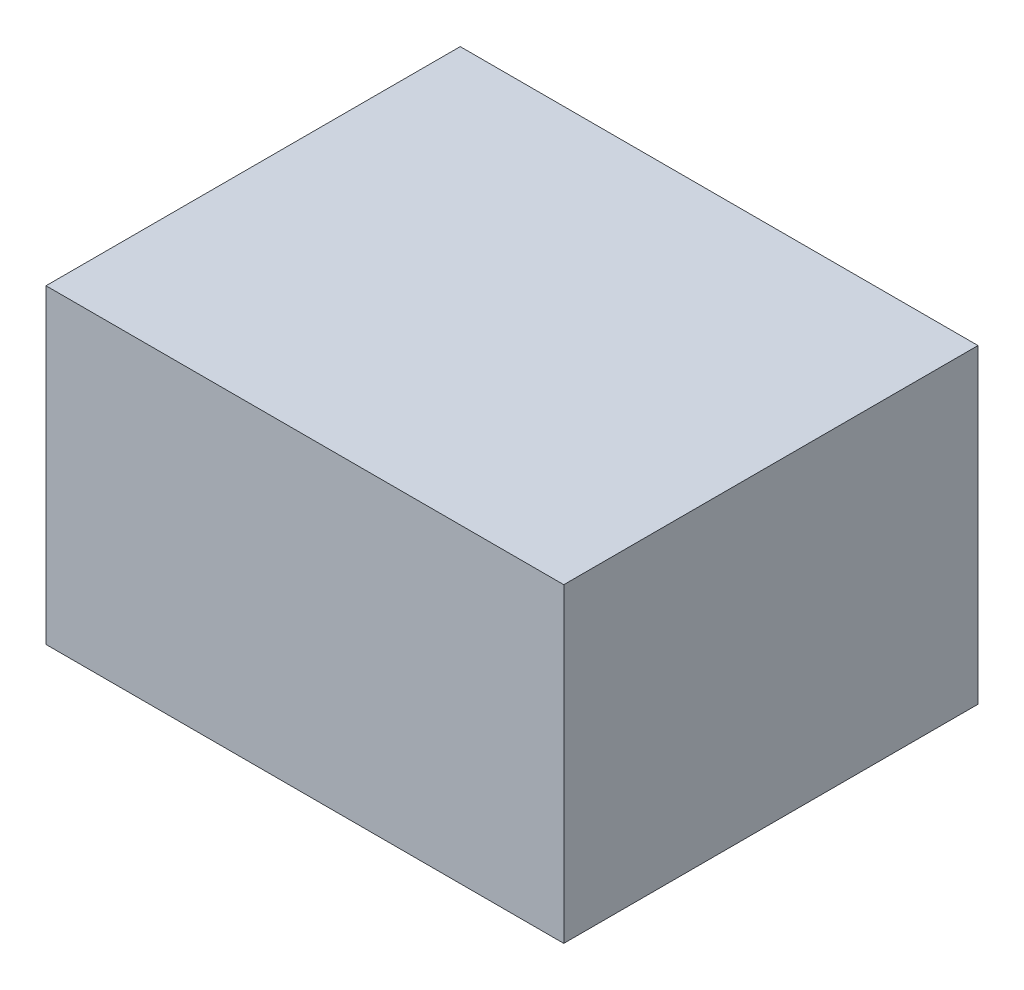
ISO-10303-21;
HEADER;
FILE_DESCRIPTION(('STEP AP214'),'2;1');
FILE_NAME('part.step','',(''),(''),'','','');
FILE_SCHEMA(('AUTOMOTIVE_DESIGN { 1 0 10303 214 1 1 1 1 }'));
ENDSEC;
DATA;
#1=APPLICATION_CONTEXT('core data for automotive mechanical design processes');
#2=APPLICATION_PROTOCOL_DEFINITION('international standard','automotive_design',2000,#1);
#3=PRODUCT_CONTEXT('',#1,'mechanical');
#4=PRODUCT('Part','Part','',(#3));
#5=PRODUCT_RELATED_PRODUCT_CATEGORY('part','',(#4));
#6=PRODUCT_DEFINITION_FORMATION('','',#4);
#7=PRODUCT_DEFINITION_CONTEXT('part definition',#1,'design');
#8=PRODUCT_DEFINITION('design','',#6,#7);
#9=PRODUCT_DEFINITION_SHAPE('','',#8);
#10=(LENGTH_UNIT() NAMED_UNIT(*) SI_UNIT(.MILLI.,.METRE.));
#11=(NAMED_UNIT(*) PLANE_ANGLE_UNIT() SI_UNIT($,.RADIAN.));
#12=(NAMED_UNIT(*) SI_UNIT($,.STERADIAN.) SOLID_ANGLE_UNIT());
#13=UNCERTAINTY_MEASURE_WITH_UNIT(LENGTH_MEASURE(1.E-05),#10,'distance_accuracy_value','');
#14=(GEOMETRIC_REPRESENTATION_CONTEXT(3) GLOBAL_UNCERTAINTY_ASSIGNED_CONTEXT((#13)) GLOBAL_UNIT_ASSIGNED_CONTEXT((#10,
#11,#12)) REPRESENTATION_CONTEXT('',''));
#15=CARTESIAN_POINT('',(0.,0.,0.));
#16=DIRECTION('',(0.,0.,1.));
#17=DIRECTION('',(1.,0.,0.));
#18=AXIS2_PLACEMENT_3D('',#15,#16,#17);
#19=CARTESIAN_POINT('',(0.,0.,40.));
#20=DIRECTION('',(1.,0.,0.));
#21=DIRECTION('',(0.,1.,0.));
#22=AXIS2_PLACEMENT_3D('',#19,#20,#21);
#23=PLANE('',#22);
#24=DIRECTION('',(0.,-1.,0.));
#25=VECTOR('',#24,1.);
#26=CARTESIAN_POINT('',(0.,0.,0.));
#27=LINE('',#26,#25);
#28=CARTESIAN_POINT('',(0.,30.,0.));
#29=VERTEX_POINT('',#28);
#30=CARTESIAN_POINT('',(0.,0.,0.));
#31=VERTEX_POINT('',#30);
#32=EDGE_CURVE('E107',#29,#31,#27,.T.);
#33=ORIENTED_EDGE('',*,*,#32,.T.);
#34=DIRECTION('',(0.,0.,-1.));
#35=VECTOR('',#34,1.);
#36=CARTESIAN_POINT('',(0.,0.,40.));
#37=LINE('',#36,#35);
#38=CARTESIAN_POINT('',(0.,0.,40.));
#39=VERTEX_POINT('',#38);
#40=EDGE_CURVE('E11',#39,#31,#37,.T.);
#41=ORIENTED_EDGE('',*,*,#40,.F.);
#42=DIRECTION('',(0.,-1.,0.));
#43=VECTOR('',#42,1.);
#44=CARTESIAN_POINT('',(0.,0.,40.));
#45=LINE('',#44,#43);
#46=CARTESIAN_POINT('',(0.,30.,40.));
#47=VERTEX_POINT('',#46);
#48=EDGE_CURVE('E91',#47,#39,#45,.T.);
#49=ORIENTED_EDGE('',*,*,#48,.F.);
#50=DIRECTION('',(0.,0.,-1.));
#51=VECTOR('',#50,1.);
#52=CARTESIAN_POINT('',(0.,30.,40.));
#53=LINE('',#52,#51);
#54=EDGE_CURVE('E103',#47,#29,#53,.T.);
#55=ORIENTED_EDGE('',*,*,#54,.T.);
#56=EDGE_LOOP('',(#33,#41,#49,#55));
#57=FACE_BOUND('',#56,.T.);
#58=ADVANCED_FACE('F39',(#57),#23,.F.);
#59=CARTESIAN_POINT('',(0.,0.,40.));
#60=DIRECTION('',(0.,1.,0.));
#61=DIRECTION('',(0.,0.,1.));
#62=AXIS2_PLACEMENT_3D('',#59,#60,#61);
#63=PLANE('',#62);
#64=DIRECTION('',(1.,0.,0.));
#65=VECTOR('',#64,1.);
#66=CARTESIAN_POINT('',(0.,0.,0.));
#67=LINE('',#66,#65);
#68=CARTESIAN_POINT('',(50.,0.,0.));
#69=VERTEX_POINT('',#68);
#70=EDGE_CURVE('E96',#31,#69,#67,.T.);
#71=ORIENTED_EDGE('',*,*,#70,.T.);
#72=DIRECTION('',(0.,0.,-1.));
#73=VECTOR('',#72,1.);
#74=CARTESIAN_POINT('',(50.,0.,40.));
#75=LINE('',#74,#73);
#76=CARTESIAN_POINT('',(50.,0.,40.));
#77=VERTEX_POINT('',#76);
#78=EDGE_CURVE('E48',#77,#69,#75,.T.);
#79=ORIENTED_EDGE('',*,*,#78,.F.);
#80=DIRECTION('',(1.,0.,0.));
#81=VECTOR('',#80,1.);
#82=CARTESIAN_POINT('',(0.,0.,40.));
#83=LINE('',#82,#81);
#84=EDGE_CURVE('E86',#39,#77,#83,.T.);
#85=ORIENTED_EDGE('',*,*,#84,.F.);
#86=ORIENTED_EDGE('',*,*,#40,.T.);
#87=EDGE_LOOP('',(#71,#79,#85,#86));
#88=FACE_BOUND('',#87,.T.);
#89=ADVANCED_FACE('F95',(#88),#63,.F.);
#90=CARTESIAN_POINT('',(50.,0.,40.));
#91=DIRECTION('',(-1.,0.,0.));
#92=DIRECTION('',(0.,-1.,0.));
#93=AXIS2_PLACEMENT_3D('',#90,#91,#92);
#94=PLANE('',#93);
#95=DIRECTION('',(0.,1.,0.));
#96=VECTOR('',#95,1.);
#97=CARTESIAN_POINT('',(50.,0.,0.));
#98=LINE('',#97,#96);
#99=CARTESIAN_POINT('',(50.,30.,0.));
#100=VERTEX_POINT('',#99);
#101=EDGE_CURVE('E73',#69,#100,#98,.T.);
#102=ORIENTED_EDGE('',*,*,#101,.T.);
#103=DIRECTION('',(0.,0.,-1.));
#104=VECTOR('',#103,1.);
#105=CARTESIAN_POINT('',(50.,30.,40.));
#106=LINE('',#105,#104);
#107=CARTESIAN_POINT('',(50.,30.,40.));
#108=VERTEX_POINT('',#107);
#109=EDGE_CURVE('E98',#108,#100,#106,.T.);
#110=ORIENTED_EDGE('',*,*,#109,.F.);
#111=DIRECTION('',(0.,1.,0.));
#112=VECTOR('',#111,1.);
#113=CARTESIAN_POINT('',(50.,0.,40.));
#114=LINE('',#113,#112);
#115=EDGE_CURVE('E89',#77,#108,#114,.T.);
#116=ORIENTED_EDGE('',*,*,#115,.F.);
#117=ORIENTED_EDGE('',*,*,#78,.T.);
#118=EDGE_LOOP('',(#102,#110,#116,#117));
#119=FACE_BOUND('',#118,.T.);
#120=ADVANCED_FACE('F99',(#119),#94,.F.);
#121=CARTESIAN_POINT('',(0.,30.,40.));
#122=DIRECTION('',(0.,-1.,0.));
#123=DIRECTION('',(0.,0.,-1.));
#124=AXIS2_PLACEMENT_3D('',#121,#122,#123);
#125=PLANE('',#124);
#126=DIRECTION('',(-1.,0.,0.));
#127=VECTOR('',#126,1.);
#128=CARTESIAN_POINT('',(0.,30.,0.));
#129=LINE('',#128,#127);
#130=EDGE_CURVE('E79',#100,#29,#129,.T.);
#131=ORIENTED_EDGE('',*,*,#130,.T.);
#132=ORIENTED_EDGE('',*,*,#54,.F.);
#133=DIRECTION('',(-1.,0.,0.));
#134=VECTOR('',#133,1.);
#135=CARTESIAN_POINT('',(0.,30.,40.));
#136=LINE('',#135,#134);
#137=EDGE_CURVE('E56',#108,#47,#136,.T.);
#138=ORIENTED_EDGE('',*,*,#137,.F.);
#139=ORIENTED_EDGE('',*,*,#109,.T.);
#140=EDGE_LOOP('',(#131,#132,#138,#139));
#141=FACE_BOUND('',#140,.T.);
#142=ADVANCED_FACE('F120',(#141),#125,.F.);
#143=CARTESIAN_POINT('',(0.,0.,40.));
#144=DIRECTION('',(0.,0.,-1.));
#145=DIRECTION('',(-1.,0.,0.));
#146=AXIS2_PLACEMENT_3D('',#143,#144,#145);
#147=PLANE('',#146);
#148=ORIENTED_EDGE('',*,*,#48,.T.);
#149=ORIENTED_EDGE('',*,*,#84,.T.);
#150=ORIENTED_EDGE('',*,*,#115,.T.);
#151=ORIENTED_EDGE('',*,*,#137,.T.);
#152=EDGE_LOOP('',(#148,#149,#150,#151));
#153=FACE_BOUND('',#152,.T.);
#154=ADVANCED_FACE('F87',(#153),#147,.F.);
#155=CARTESIAN_POINT('',(0.,0.,0.));
#156=DIRECTION('',(0.,0.,-1.));
#157=DIRECTION('',(-1.,0.,0.));
#158=AXIS2_PLACEMENT_3D('',#155,#156,#157);
#159=PLANE('',#158);
#160=ORIENTED_EDGE('',*,*,#32,.F.);
#161=ORIENTED_EDGE('',*,*,#130,.F.);
#162=ORIENTED_EDGE('',*,*,#101,.F.);
#163=ORIENTED_EDGE('',*,*,#70,.F.);
#164=EDGE_LOOP('',(#160,#161,#162,#163));
#165=FACE_BOUND('',#164,.T.);
#166=ADVANCED_FACE('F123',(#165),#159,.T.);
#167=CLOSED_SHELL('',(#58,#89,#120,#142,#154,#166));
#168=MANIFOLD_SOLID_BREP('B2',#167);
#169=ADVANCED_BREP_SHAPE_REPRESENTATION('',(#18,#168),#14);
#170=SHAPE_DEFINITION_REPRESENTATION(#9,#169);
ENDSEC;
END-ISO-10303-21;
